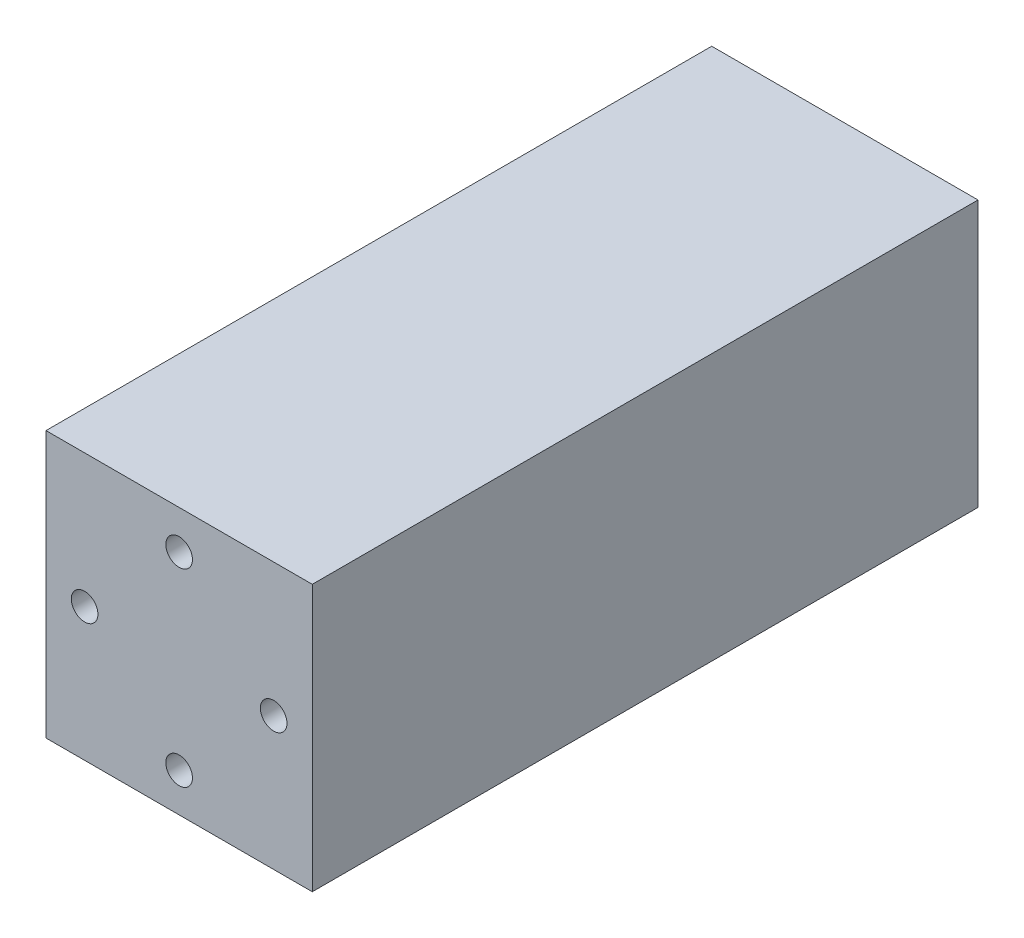
ISO-10303-21;
HEADER;
FILE_DESCRIPTION(('STEP AP214'),'2;1');
FILE_NAME('part.step','',(''),(''),'','','');
FILE_SCHEMA(('AUTOMOTIVE_DESIGN { 1 0 10303 214 1 1 1 1 }'));
ENDSEC;
DATA;
#1=APPLICATION_CONTEXT('core data for automotive mechanical design processes');
#2=APPLICATION_PROTOCOL_DEFINITION('international standard','automotive_design',2000,#1);
#3=PRODUCT_CONTEXT('',#1,'mechanical');
#4=PRODUCT('Part','Part','',(#3));
#5=PRODUCT_RELATED_PRODUCT_CATEGORY('part','',(#4));
#6=PRODUCT_DEFINITION_FORMATION('','',#4);
#7=PRODUCT_DEFINITION_CONTEXT('part definition',#1,'design');
#8=PRODUCT_DEFINITION('design','',#6,#7);
#9=PRODUCT_DEFINITION_SHAPE('','',#8);
#10=(LENGTH_UNIT() NAMED_UNIT(*) SI_UNIT(.MILLI.,.METRE.));
#11=(NAMED_UNIT(*) PLANE_ANGLE_UNIT() SI_UNIT($,.RADIAN.));
#12=(NAMED_UNIT(*) SI_UNIT($,.STERADIAN.) SOLID_ANGLE_UNIT());
#13=UNCERTAINTY_MEASURE_WITH_UNIT(LENGTH_MEASURE(1.E-05),#10,'distance_accuracy_value','');
#14=(GEOMETRIC_REPRESENTATION_CONTEXT(3) GLOBAL_UNCERTAINTY_ASSIGNED_CONTEXT((#13)) GLOBAL_UNIT_ASSIGNED_CONTEXT((#10,
#11,#12)) REPRESENTATION_CONTEXT('',''));
#15=CARTESIAN_POINT('',(0.,0.,0.));
#16=DIRECTION('',(0.,0.,1.));
#17=DIRECTION('',(1.,0.,0.));
#18=AXIS2_PLACEMENT_3D('',#15,#16,#17);
#19=CARTESIAN_POINT('',(-10.,-10.,50.));
#20=DIRECTION('',(-1.,0.,0.));
#21=DIRECTION('',(0.,0.,1.));
#22=AXIS2_PLACEMENT_3D('',#19,#20,#21);
#23=PLANE('',#22);
#24=DIRECTION('',(0.,1.,0.));
#25=VECTOR('',#24,1.);
#26=CARTESIAN_POINT('',(-10.,-10.,0.));
#27=LINE('',#26,#25);
#28=CARTESIAN_POINT('',(-10.,-10.,0.));
#29=VERTEX_POINT('',#28);
#30=CARTESIAN_POINT('',(-10.,10.,0.));
#31=VERTEX_POINT('',#30);
#32=EDGE_CURVE('E105',#29,#31,#27,.T.);
#33=ORIENTED_EDGE('',*,*,#32,.F.);
#34=DIRECTION('',(0.,0.,-1.));
#35=VECTOR('',#34,1.);
#36=CARTESIAN_POINT('',(-10.,-10.,50.));
#37=LINE('',#36,#35);
#38=CARTESIAN_POINT('',(-10.,-10.,50.));
#39=VERTEX_POINT('',#38);
#40=EDGE_CURVE('E11',#39,#29,#37,.T.);
#41=ORIENTED_EDGE('',*,*,#40,.F.);
#42=DIRECTION('',(0.,1.,0.));
#43=VECTOR('',#42,1.);
#44=CARTESIAN_POINT('',(-10.,-10.,50.));
#45=LINE('',#44,#43);
#46=CARTESIAN_POINT('',(-10.,10.,50.));
#47=VERTEX_POINT('',#46);
#48=EDGE_CURVE('E99',#39,#47,#45,.T.);
#49=ORIENTED_EDGE('',*,*,#48,.T.);
#50=DIRECTION('',(0.,0.,-1.));
#51=VECTOR('',#50,1.);
#52=CARTESIAN_POINT('',(-10.,10.,50.));
#53=LINE('',#52,#51);
#54=EDGE_CURVE('E42',#47,#31,#53,.T.);
#55=ORIENTED_EDGE('',*,*,#54,.T.);
#56=EDGE_LOOP('',(#33,#41,#49,#55));
#57=FACE_BOUND('',#56,.T.);
#58=ADVANCED_FACE('F39',(#57),#23,.T.);
#59=CARTESIAN_POINT('',(-10.,-10.,50.));
#60=DIRECTION('',(0.,1.,0.));
#61=DIRECTION('',(0.,0.,1.));
#62=AXIS2_PLACEMENT_3D('',#59,#60,#61);
#63=PLANE('',#62);
#64=DIRECTION('',(1.,0.,0.));
#65=VECTOR('',#64,1.);
#66=CARTESIAN_POINT('',(-10.,-10.,0.));
#67=LINE('',#66,#65);
#68=CARTESIAN_POINT('',(10.,-10.,0.));
#69=VERTEX_POINT('',#68);
#70=EDGE_CURVE('E72',#29,#69,#67,.T.);
#71=ORIENTED_EDGE('',*,*,#70,.T.);
#72=DIRECTION('',(0.,0.,-1.));
#73=VECTOR('',#72,1.);
#74=CARTESIAN_POINT('',(10.,-10.,50.));
#75=LINE('',#74,#73);
#76=CARTESIAN_POINT('',(10.,-10.,50.));
#77=VERTEX_POINT('',#76);
#78=EDGE_CURVE('E48',#77,#69,#75,.T.);
#79=ORIENTED_EDGE('',*,*,#78,.F.);
#80=DIRECTION('',(1.,0.,0.));
#81=VECTOR('',#80,1.);
#82=CARTESIAN_POINT('',(-10.,-10.,50.));
#83=LINE('',#82,#81);
#84=EDGE_CURVE('E89',#39,#77,#83,.T.);
#85=ORIENTED_EDGE('',*,*,#84,.F.);
#86=ORIENTED_EDGE('',*,*,#40,.T.);
#87=EDGE_LOOP('',(#71,#79,#85,#86));
#88=FACE_BOUND('',#87,.T.);
#89=ADVANCED_FACE('F116',(#88),#63,.F.);
#90=CARTESIAN_POINT('',(10.,-10.,50.));
#91=DIRECTION('',(-1.,0.,0.));
#92=DIRECTION('',(0.,0.,1.));
#93=AXIS2_PLACEMENT_3D('',#90,#91,#92);
#94=PLANE('',#93);
#95=DIRECTION('',(0.,1.,0.));
#96=VECTOR('',#95,1.);
#97=CARTESIAN_POINT('',(10.,-10.,0.));
#98=LINE('',#97,#96);
#99=CARTESIAN_POINT('',(10.,10.,0.));
#100=VERTEX_POINT('',#99);
#101=EDGE_CURVE('E96',#69,#100,#98,.T.);
#102=ORIENTED_EDGE('',*,*,#101,.T.);
#103=DIRECTION('',(0.,0.,-1.));
#104=VECTOR('',#103,1.);
#105=CARTESIAN_POINT('',(10.,10.,50.));
#106=LINE('',#105,#104);
#107=CARTESIAN_POINT('',(10.,10.,50.));
#108=VERTEX_POINT('',#107);
#109=EDGE_CURVE('E93',#108,#100,#106,.T.);
#110=ORIENTED_EDGE('',*,*,#109,.F.);
#111=DIRECTION('',(0.,1.,0.));
#112=VECTOR('',#111,1.);
#113=CARTESIAN_POINT('',(10.,-10.,50.));
#114=LINE('',#113,#112);
#115=EDGE_CURVE('E84',#77,#108,#114,.T.);
#116=ORIENTED_EDGE('',*,*,#115,.F.);
#117=ORIENTED_EDGE('',*,*,#78,.T.);
#118=EDGE_LOOP('',(#102,#110,#116,#117));
#119=FACE_BOUND('',#118,.T.);
#120=ADVANCED_FACE('F94',(#119),#94,.F.);
#121=CARTESIAN_POINT('',(-10.,10.,50.));
#122=DIRECTION('',(0.,1.,0.));
#123=DIRECTION('',(0.,0.,1.));
#124=AXIS2_PLACEMENT_3D('',#121,#122,#123);
#125=PLANE('',#124);
#126=DIRECTION('',(1.,0.,0.));
#127=VECTOR('',#126,1.);
#128=CARTESIAN_POINT('',(-10.,10.,0.));
#129=LINE('',#128,#127);
#130=EDGE_CURVE('E108',#31,#100,#129,.T.);
#131=ORIENTED_EDGE('',*,*,#130,.F.);
#132=ORIENTED_EDGE('',*,*,#54,.F.);
#133=DIRECTION('',(1.,0.,0.));
#134=VECTOR('',#133,1.);
#135=CARTESIAN_POINT('',(-10.,10.,50.));
#136=LINE('',#135,#134);
#137=EDGE_CURVE('E88',#47,#108,#136,.T.);
#138=ORIENTED_EDGE('',*,*,#137,.T.);
#139=ORIENTED_EDGE('',*,*,#109,.T.);
#140=EDGE_LOOP('',(#131,#132,#138,#139));
#141=FACE_BOUND('',#140,.T.);
#142=ADVANCED_FACE('F98',(#141),#125,.T.);
#143=CARTESIAN_POINT('',(0.,0.,50.));
#144=DIRECTION('',(0.,0.,-1.));
#145=DIRECTION('',(-1.,0.,0.));
#146=AXIS2_PLACEMENT_3D('',#143,#144,#145);
#147=PLANE('',#146);
#148=CARTESIAN_POINT('',(0.,7.1,50.));
#149=DIRECTION('',(0.,0.,-1.));
#150=DIRECTION('',(-1.,0.,0.));
#151=AXIS2_PLACEMENT_3D('',#148,#149,#150);
#152=CIRCLE('',#151,1.);
#153=CARTESIAN_POINT('',(-1.,7.1,50.));
#154=VERTEX_POINT('',#153);
#155=EDGE_CURVE('E208',#154,#154,#152,.T.);
#156=ORIENTED_EDGE('',*,*,#155,.T.);
#157=EDGE_LOOP('',(#156));
#158=FACE_BOUND('',#157,.T.);
#159=CARTESIAN_POINT('',(-7.1,0.,50.));
#160=DIRECTION('',(0.,0.,-1.));
#161=DIRECTION('',(-1.,0.,0.));
#162=AXIS2_PLACEMENT_3D('',#159,#160,#161);
#163=CIRCLE('',#162,1.);
#164=CARTESIAN_POINT('',(-8.1,0.,50.));
#165=VERTEX_POINT('',#164);
#166=EDGE_CURVE('E212',#165,#165,#163,.T.);
#167=ORIENTED_EDGE('',*,*,#166,.T.);
#168=EDGE_LOOP('',(#167));
#169=FACE_BOUND('',#168,.T.);
#170=CARTESIAN_POINT('',(7.1,0.,50.));
#171=DIRECTION('',(0.,0.,-1.));
#172=DIRECTION('',(-1.,0.,0.));
#173=AXIS2_PLACEMENT_3D('',#170,#171,#172);
#174=CIRCLE('',#173,1.);
#175=CARTESIAN_POINT('',(6.1,0.,50.));
#176=VERTEX_POINT('',#175);
#177=EDGE_CURVE('E220',#176,#176,#174,.T.);
#178=ORIENTED_EDGE('',*,*,#177,.T.);
#179=EDGE_LOOP('',(#178));
#180=FACE_BOUND('',#179,.T.);
#181=CARTESIAN_POINT('',(0.,-7.1,50.));
#182=DIRECTION('',(0.,0.,-1.));
#183=DIRECTION('',(-1.,0.,0.));
#184=AXIS2_PLACEMENT_3D('',#181,#182,#183);
#185=CIRCLE('',#184,1.);
#186=CARTESIAN_POINT('',(-1.,-7.1,50.));
#187=VERTEX_POINT('',#186);
#188=EDGE_CURVE('E226',#187,#187,#185,.T.);
#189=ORIENTED_EDGE('',*,*,#188,.T.);
#190=EDGE_LOOP('',(#189));
#191=FACE_BOUND('',#190,.T.);
#192=ORIENTED_EDGE('',*,*,#48,.F.);
#193=ORIENTED_EDGE('',*,*,#84,.T.);
#194=ORIENTED_EDGE('',*,*,#115,.T.);
#195=ORIENTED_EDGE('',*,*,#137,.F.);
#196=EDGE_LOOP('',(#192,#193,#194,#195));
#197=FACE_BOUND('',#196,.T.);
#198=ADVANCED_FACE('F87',(#158,#169,#180,#191,#197),#147,.F.);
#199=CARTESIAN_POINT('',(0.,0.,0.));
#200=DIRECTION('',(0.,0.,-1.));
#201=DIRECTION('',(-1.,0.,0.));
#202=AXIS2_PLACEMENT_3D('',#199,#200,#201);
#203=PLANE('',#202);
#204=CARTESIAN_POINT('',(0.,7.1,0.));
#205=DIRECTION('',(0.,0.,1.));
#206=DIRECTION('',(1.,0.,0.));
#207=AXIS2_PLACEMENT_3D('',#204,#205,#206);
#208=CIRCLE('',#207,1.);
#209=CARTESIAN_POINT('',(1.,7.1,0.));
#210=VERTEX_POINT('',#209);
#211=EDGE_CURVE('E234',#210,#210,#208,.T.);
#212=ORIENTED_EDGE('',*,*,#211,.T.);
#213=EDGE_LOOP('',(#212));
#214=FACE_BOUND('',#213,.T.);
#215=CARTESIAN_POINT('',(-7.1,0.,0.));
#216=DIRECTION('',(0.,0.,1.));
#217=DIRECTION('',(1.,0.,0.));
#218=AXIS2_PLACEMENT_3D('',#215,#216,#217);
#219=CIRCLE('',#218,1.);
#220=CARTESIAN_POINT('',(-6.1,0.,0.));
#221=VERTEX_POINT('',#220);
#222=EDGE_CURVE('E237',#221,#221,#219,.T.);
#223=ORIENTED_EDGE('',*,*,#222,.T.);
#224=EDGE_LOOP('',(#223));
#225=FACE_BOUND('',#224,.T.);
#226=CARTESIAN_POINT('',(7.1,0.,0.));
#227=DIRECTION('',(0.,0.,1.));
#228=DIRECTION('',(1.,0.,0.));
#229=AXIS2_PLACEMENT_3D('',#226,#227,#228);
#230=CIRCLE('',#229,1.);
#231=CARTESIAN_POINT('',(8.1,0.,0.));
#232=VERTEX_POINT('',#231);
#233=EDGE_CURVE('E243',#232,#232,#230,.T.);
#234=ORIENTED_EDGE('',*,*,#233,.T.);
#235=EDGE_LOOP('',(#234));
#236=FACE_BOUND('',#235,.T.);
#237=CARTESIAN_POINT('',(0.,-7.1,0.));
#238=DIRECTION('',(0.,0.,1.));
#239=DIRECTION('',(1.,0.,0.));
#240=AXIS2_PLACEMENT_3D('',#237,#238,#239);
#241=CIRCLE('',#240,1.);
#242=CARTESIAN_POINT('',(1.,-7.1,0.));
#243=VERTEX_POINT('',#242);
#244=EDGE_CURVE('E211',#243,#243,#241,.T.);
#245=ORIENTED_EDGE('',*,*,#244,.T.);
#246=EDGE_LOOP('',(#245));
#247=FACE_BOUND('',#246,.T.);
#248=ORIENTED_EDGE('',*,*,#32,.T.);
#249=ORIENTED_EDGE('',*,*,#130,.T.);
#250=ORIENTED_EDGE('',*,*,#101,.F.);
#251=ORIENTED_EDGE('',*,*,#70,.F.);
#252=EDGE_LOOP('',(#248,#249,#250,#251));
#253=FACE_BOUND('',#252,.T.);
#254=ADVANCED_FACE('F114',(#214,#225,#236,#247,#253),#203,.T.);
#255=CARTESIAN_POINT('',(0.,-7.1,3.));
#256=DIRECTION('',(0.,0.,-1.));
#257=DIRECTION('',(-1.,0.,0.));
#258=AXIS2_PLACEMENT_3D('',#255,#256,#257);
#259=CYLINDRICAL_SURFACE('',#258,1.);
#260=CARTESIAN_POINT('',(0.,-7.1,3.));
#261=DIRECTION('',(0.,0.,1.));
#262=DIRECTION('',(1.,0.,0.));
#263=AXIS2_PLACEMENT_3D('',#260,#261,#262);
#264=CIRCLE('',#263,1.);
#265=CARTESIAN_POINT('',(1.,-7.1,3.));
#266=VERTEX_POINT('',#265);
#267=EDGE_CURVE('E207',#266,#266,#264,.T.);
#268=ORIENTED_EDGE('',*,*,#267,.T.);
#269=EDGE_LOOP('',(#268));
#270=FACE_BOUND('',#269,.T.);
#271=ORIENTED_EDGE('',*,*,#244,.F.);
#272=EDGE_LOOP('',(#271));
#273=FACE_BOUND('',#272,.T.);
#274=ADVANCED_FACE('F135',(#270,#273),#259,.F.);
#275=CARTESIAN_POINT('',(0.,-7.1,3.));
#276=DIRECTION('',(0.,0.,1.));
#277=DIRECTION('',(1.,0.,0.));
#278=AXIS2_PLACEMENT_3D('',#275,#276,#277);
#279=PLANE('',#278);
#280=ORIENTED_EDGE('',*,*,#267,.F.);
#281=EDGE_LOOP('',(#280));
#282=FACE_BOUND('',#281,.T.);
#283=ADVANCED_FACE('F140',(#282),#279,.F.);
#284=CARTESIAN_POINT('',(7.1,0.,3.));
#285=DIRECTION('',(0.,0.,-1.));
#286=DIRECTION('',(-1.,0.,0.));
#287=AXIS2_PLACEMENT_3D('',#284,#285,#286);
#288=CYLINDRICAL_SURFACE('',#287,1.);
#289=CARTESIAN_POINT('',(7.1,0.,3.));
#290=DIRECTION('',(0.,0.,1.));
#291=DIRECTION('',(1.,0.,0.));
#292=AXIS2_PLACEMENT_3D('',#289,#290,#291);
#293=CIRCLE('',#292,1.);
#294=CARTESIAN_POINT('',(8.1,0.,3.));
#295=VERTEX_POINT('',#294);
#296=EDGE_CURVE('E246',#295,#295,#293,.T.);
#297=ORIENTED_EDGE('',*,*,#296,.T.);
#298=EDGE_LOOP('',(#297));
#299=FACE_BOUND('',#298,.T.);
#300=ORIENTED_EDGE('',*,*,#233,.F.);
#301=EDGE_LOOP('',(#300));
#302=FACE_BOUND('',#301,.T.);
#303=ADVANCED_FACE('F143',(#299,#302),#288,.F.);
#304=CARTESIAN_POINT('',(7.1,0.,3.));
#305=DIRECTION('',(0.,0.,1.));
#306=DIRECTION('',(1.,0.,0.));
#307=AXIS2_PLACEMENT_3D('',#304,#305,#306);
#308=PLANE('',#307);
#309=ORIENTED_EDGE('',*,*,#296,.F.);
#310=EDGE_LOOP('',(#309));
#311=FACE_BOUND('',#310,.T.);
#312=ADVANCED_FACE('F148',(#311),#308,.F.);
#313=CARTESIAN_POINT('',(-7.1,0.,3.));
#314=DIRECTION('',(0.,0.,-1.));
#315=DIRECTION('',(-1.,0.,0.));
#316=AXIS2_PLACEMENT_3D('',#313,#314,#315);
#317=CYLINDRICAL_SURFACE('',#316,1.);
#318=CARTESIAN_POINT('',(-7.1,0.,3.));
#319=DIRECTION('',(0.,0.,1.));
#320=DIRECTION('',(1.,0.,0.));
#321=AXIS2_PLACEMENT_3D('',#318,#319,#320);
#322=CIRCLE('',#321,1.);
#323=CARTESIAN_POINT('',(-6.1,0.,3.));
#324=VERTEX_POINT('',#323);
#325=EDGE_CURVE('E240',#324,#324,#322,.T.);
#326=ORIENTED_EDGE('',*,*,#325,.T.);
#327=EDGE_LOOP('',(#326));
#328=FACE_BOUND('',#327,.T.);
#329=ORIENTED_EDGE('',*,*,#222,.F.);
#330=EDGE_LOOP('',(#329));
#331=FACE_BOUND('',#330,.T.);
#332=ADVANCED_FACE('F151',(#328,#331),#317,.F.);
#333=CARTESIAN_POINT('',(-7.1,0.,3.));
#334=DIRECTION('',(0.,0.,1.));
#335=DIRECTION('',(1.,0.,0.));
#336=AXIS2_PLACEMENT_3D('',#333,#334,#335);
#337=PLANE('',#336);
#338=ORIENTED_EDGE('',*,*,#325,.F.);
#339=EDGE_LOOP('',(#338));
#340=FACE_BOUND('',#339,.T.);
#341=ADVANCED_FACE('F156',(#340),#337,.F.);
#342=CARTESIAN_POINT('',(0.,7.1,3.));
#343=DIRECTION('',(0.,0.,-1.));
#344=DIRECTION('',(-1.,0.,0.));
#345=AXIS2_PLACEMENT_3D('',#342,#343,#344);
#346=CYLINDRICAL_SURFACE('',#345,1.);
#347=CARTESIAN_POINT('',(0.,7.1,3.));
#348=DIRECTION('',(0.,0.,1.));
#349=DIRECTION('',(1.,0.,0.));
#350=AXIS2_PLACEMENT_3D('',#347,#348,#349);
#351=CIRCLE('',#350,1.);
#352=CARTESIAN_POINT('',(1.,7.1,3.));
#353=VERTEX_POINT('',#352);
#354=EDGE_CURVE('E109',#353,#353,#351,.T.);
#355=ORIENTED_EDGE('',*,*,#354,.T.);
#356=EDGE_LOOP('',(#355));
#357=FACE_BOUND('',#356,.T.);
#358=ORIENTED_EDGE('',*,*,#211,.F.);
#359=EDGE_LOOP('',(#358));
#360=FACE_BOUND('',#359,.T.);
#361=ADVANCED_FACE('F159',(#357,#360),#346,.F.);
#362=CARTESIAN_POINT('',(0.,7.1,3.));
#363=DIRECTION('',(0.,0.,1.));
#364=DIRECTION('',(1.,0.,0.));
#365=AXIS2_PLACEMENT_3D('',#362,#363,#364);
#366=PLANE('',#365);
#367=ORIENTED_EDGE('',*,*,#354,.F.);
#368=EDGE_LOOP('',(#367));
#369=FACE_BOUND('',#368,.T.);
#370=ADVANCED_FACE('F166',(#369),#366,.F.);
#371=CARTESIAN_POINT('',(0.,-7.1,47.));
#372=DIRECTION('',(0.,0.,1.));
#373=DIRECTION('',(1.,0.,0.));
#374=AXIS2_PLACEMENT_3D('',#371,#372,#373);
#375=CYLINDRICAL_SURFACE('',#374,1.);
#376=CARTESIAN_POINT('',(0.,-7.1,47.));
#377=DIRECTION('',(0.,0.,-1.));
#378=DIRECTION('',(-1.,0.,0.));
#379=AXIS2_PLACEMENT_3D('',#376,#377,#378);
#380=CIRCLE('',#379,1.);
#381=CARTESIAN_POINT('',(-1.,-7.1,47.));
#382=VERTEX_POINT('',#381);
#383=EDGE_CURVE('E229',#382,#382,#380,.T.);
#384=ORIENTED_EDGE('',*,*,#383,.T.);
#385=EDGE_LOOP('',(#384));
#386=FACE_BOUND('',#385,.T.);
#387=ORIENTED_EDGE('',*,*,#188,.F.);
#388=EDGE_LOOP('',(#387));
#389=FACE_BOUND('',#388,.T.);
#390=ADVANCED_FACE('F170',(#386,#389),#375,.F.);
#391=CARTESIAN_POINT('',(0.,-7.1,47.));
#392=DIRECTION('',(0.,0.,-1.));
#393=DIRECTION('',(-1.,0.,0.));
#394=AXIS2_PLACEMENT_3D('',#391,#392,#393);
#395=PLANE('',#394);
#396=ORIENTED_EDGE('',*,*,#383,.F.);
#397=EDGE_LOOP('',(#396));
#398=FACE_BOUND('',#397,.T.);
#399=ADVANCED_FACE('F172',(#398),#395,.F.);
#400=CARTESIAN_POINT('',(7.1,0.,47.));
#401=DIRECTION('',(0.,0.,1.));
#402=DIRECTION('',(1.,0.,0.));
#403=AXIS2_PLACEMENT_3D('',#400,#401,#402);
#404=CYLINDRICAL_SURFACE('',#403,1.);
#405=CARTESIAN_POINT('',(7.1,0.,47.));
#406=DIRECTION('',(0.,0.,-1.));
#407=DIRECTION('',(-1.,0.,0.));
#408=AXIS2_PLACEMENT_3D('',#405,#406,#407);
#409=CIRCLE('',#408,1.);
#410=CARTESIAN_POINT('',(6.1,0.,47.));
#411=VERTEX_POINT('',#410);
#412=EDGE_CURVE('E223',#411,#411,#409,.T.);
#413=ORIENTED_EDGE('',*,*,#412,.T.);
#414=EDGE_LOOP('',(#413));
#415=FACE_BOUND('',#414,.T.);
#416=ORIENTED_EDGE('',*,*,#177,.F.);
#417=EDGE_LOOP('',(#416));
#418=FACE_BOUND('',#417,.T.);
#419=ADVANCED_FACE('F175',(#415,#418),#404,.F.);
#420=CARTESIAN_POINT('',(7.1,0.,47.));
#421=DIRECTION('',(0.,0.,-1.));
#422=DIRECTION('',(-1.,0.,0.));
#423=AXIS2_PLACEMENT_3D('',#420,#421,#422);
#424=PLANE('',#423);
#425=ORIENTED_EDGE('',*,*,#412,.F.);
#426=EDGE_LOOP('',(#425));
#427=FACE_BOUND('',#426,.T.);
#428=ADVANCED_FACE('F180',(#427),#424,.F.);
#429=CARTESIAN_POINT('',(-7.1,0.,47.));
#430=DIRECTION('',(0.,0.,1.));
#431=DIRECTION('',(1.,0.,0.));
#432=AXIS2_PLACEMENT_3D('',#429,#430,#431);
#433=CYLINDRICAL_SURFACE('',#432,1.);
#434=CARTESIAN_POINT('',(-7.1,0.,47.));
#435=DIRECTION('',(0.,0.,-1.));
#436=DIRECTION('',(-1.,0.,0.));
#437=AXIS2_PLACEMENT_3D('',#434,#435,#436);
#438=CIRCLE('',#437,1.);
#439=CARTESIAN_POINT('',(-8.1,0.,47.));
#440=VERTEX_POINT('',#439);
#441=EDGE_CURVE('E217',#440,#440,#438,.T.);
#442=ORIENTED_EDGE('',*,*,#441,.T.);
#443=EDGE_LOOP('',(#442));
#444=FACE_BOUND('',#443,.T.);
#445=ORIENTED_EDGE('',*,*,#166,.F.);
#446=EDGE_LOOP('',(#445));
#447=FACE_BOUND('',#446,.T.);
#448=ADVANCED_FACE('F183',(#444,#447),#433,.F.);
#449=CARTESIAN_POINT('',(-7.1,0.,47.));
#450=DIRECTION('',(0.,0.,-1.));
#451=DIRECTION('',(-1.,0.,0.));
#452=AXIS2_PLACEMENT_3D('',#449,#450,#451);
#453=PLANE('',#452);
#454=ORIENTED_EDGE('',*,*,#441,.F.);
#455=EDGE_LOOP('',(#454));
#456=FACE_BOUND('',#455,.T.);
#457=ADVANCED_FACE('F188',(#456),#453,.F.);
#458=CARTESIAN_POINT('',(0.,7.1,47.));
#459=DIRECTION('',(0.,0.,1.));
#460=DIRECTION('',(1.,0.,0.));
#461=AXIS2_PLACEMENT_3D('',#458,#459,#460);
#462=CYLINDRICAL_SURFACE('',#461,1.);
#463=CARTESIAN_POINT('',(0.,7.1,47.));
#464=DIRECTION('',(0.,0.,-1.));
#465=DIRECTION('',(-1.,0.,0.));
#466=AXIS2_PLACEMENT_3D('',#463,#464,#465);
#467=CIRCLE('',#466,1.);
#468=CARTESIAN_POINT('',(-1.,7.1,47.));
#469=VERTEX_POINT('',#468);
#470=EDGE_CURVE('E206',#469,#469,#467,.T.);
#471=ORIENTED_EDGE('',*,*,#470,.T.);
#472=EDGE_LOOP('',(#471));
#473=FACE_BOUND('',#472,.T.);
#474=ORIENTED_EDGE('',*,*,#155,.F.);
#475=EDGE_LOOP('',(#474));
#476=FACE_BOUND('',#475,.T.);
#477=ADVANCED_FACE('F191',(#473,#476),#462,.F.);
#478=CARTESIAN_POINT('',(0.,7.1,47.));
#479=DIRECTION('',(0.,0.,-1.));
#480=DIRECTION('',(-1.,0.,0.));
#481=AXIS2_PLACEMENT_3D('',#478,#479,#480);
#482=PLANE('',#481);
#483=ORIENTED_EDGE('',*,*,#470,.F.);
#484=EDGE_LOOP('',(#483));
#485=FACE_BOUND('',#484,.T.);
#486=ADVANCED_FACE('F198',(#485),#482,.F.);
#487=CLOSED_SHELL('',(#58,#89,#120,#142,#198,#254,#274,#283,#303,#312,#332,#341,#361,#370,#390,
#399,#419,#428,#448,#457,#477,#486));
#488=MANIFOLD_SOLID_BREP('B2',#487);
#489=ADVANCED_BREP_SHAPE_REPRESENTATION('',(#18,#488),#14);
#490=SHAPE_DEFINITION_REPRESENTATION(#9,#489);
ENDSEC;
END-ISO-10303-21;
